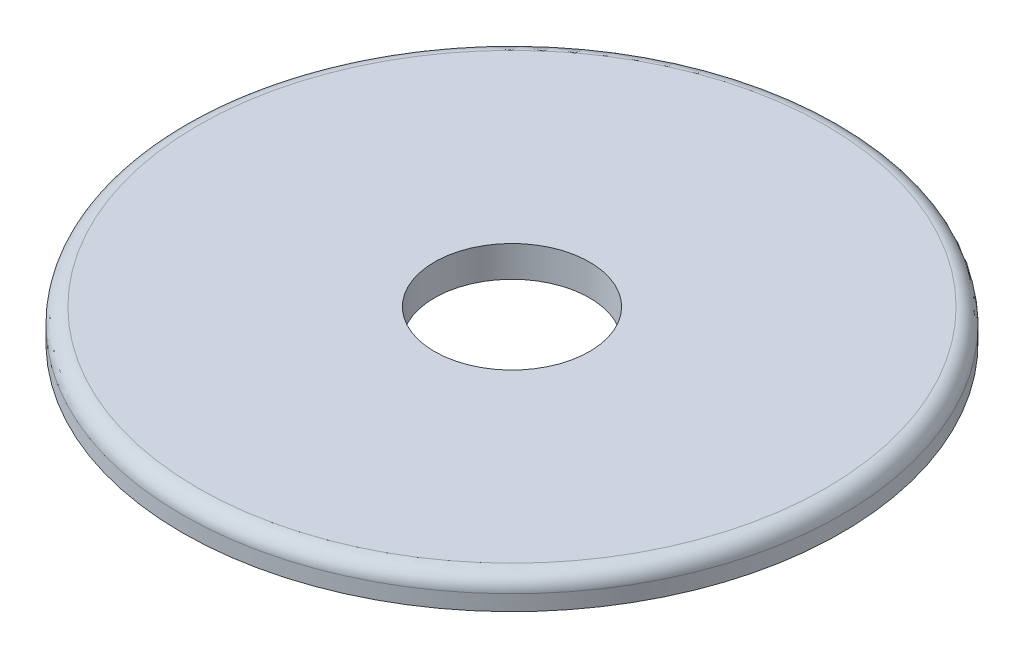
ISO-10303-21;
HEADER;
FILE_DESCRIPTION(('STEP AP214'),'2;1');
FILE_NAME('part.step','',(''),(''),'','','');
FILE_SCHEMA(('AUTOMOTIVE_DESIGN { 1 0 10303 214 1 1 1 1 }'));
ENDSEC;
DATA;
#1=APPLICATION_CONTEXT('core data for automotive mechanical design processes');
#2=APPLICATION_PROTOCOL_DEFINITION('international standard','automotive_design',2000,#1);
#3=PRODUCT_CONTEXT('',#1,'mechanical');
#4=PRODUCT('Part','Part','',(#3));
#5=PRODUCT_RELATED_PRODUCT_CATEGORY('part','',(#4));
#6=PRODUCT_DEFINITION_FORMATION('','',#4);
#7=PRODUCT_DEFINITION_CONTEXT('part definition',#1,'design');
#8=PRODUCT_DEFINITION('design','',#6,#7);
#9=PRODUCT_DEFINITION_SHAPE('','',#8);
#10=(LENGTH_UNIT() NAMED_UNIT(*) SI_UNIT(.MILLI.,.METRE.));
#11=(NAMED_UNIT(*) PLANE_ANGLE_UNIT() SI_UNIT($,.RADIAN.));
#12=(NAMED_UNIT(*) SI_UNIT($,.STERADIAN.) SOLID_ANGLE_UNIT());
#13=UNCERTAINTY_MEASURE_WITH_UNIT(LENGTH_MEASURE(1.E-05),#10,'distance_accuracy_value','');
#14=(GEOMETRIC_REPRESENTATION_CONTEXT(3) GLOBAL_UNCERTAINTY_ASSIGNED_CONTEXT((#13)) GLOBAL_UNIT_ASSIGNED_CONTEXT((#10,
#11,#12)) REPRESENTATION_CONTEXT('',''));
#15=CARTESIAN_POINT('',(0.,0.,0.));
#16=DIRECTION('',(0.,0.,1.));
#17=DIRECTION('',(1.,0.,0.));
#18=AXIS2_PLACEMENT_3D('',#15,#16,#17);
#19=CARTESIAN_POINT('',(0.,2.,0.));
#20=DIRECTION('',(0.,1.,0.));
#21=DIRECTION('',(0.,0.,1.));
#22=AXIS2_PLACEMENT_3D('',#19,#20,#21);
#23=PLANE('',#22);
#24=CARTESIAN_POINT('',(0.,2.,0.));
#25=DIRECTION('',(0.,1.,0.));
#26=DIRECTION('',(0.,0.,1.));
#27=AXIS2_PLACEMENT_3D('',#24,#25,#26);
#28=CIRCLE('',#27,20.25);
#29=CARTESIAN_POINT('',(0.,2.,20.25));
#30=VERTEX_POINT('',#29);
#31=EDGE_CURVE('E40',#30,#30,#28,.T.);
#32=ORIENTED_EDGE('',*,*,#31,.T.);
#33=EDGE_LOOP('',(#32));
#34=FACE_BOUND('',#33,.T.);
#35=CARTESIAN_POINT('',(0.,2.,0.));
#36=DIRECTION('',(0.,1.,0.));
#37=DIRECTION('',(0.,0.,1.));
#38=AXIS2_PLACEMENT_3D('',#35,#36,#37);
#39=CIRCLE('',#38,5.);
#40=CARTESIAN_POINT('',(0.,2.,5.));
#41=VERTEX_POINT('',#40);
#42=EDGE_CURVE('E48',#41,#41,#39,.T.);
#43=ORIENTED_EDGE('',*,*,#42,.F.);
#44=EDGE_LOOP('',(#43));
#45=FACE_BOUND('',#44,.T.);
#46=ADVANCED_FACE('F33',(#34,#45),#23,.T.);
#47=CARTESIAN_POINT('',(0.,0.,0.));
#48=DIRECTION('',(0.,1.,0.));
#49=DIRECTION('',(0.,0.,1.));
#50=AXIS2_PLACEMENT_3D('',#47,#48,#49);
#51=PLANE('',#50);
#52=CARTESIAN_POINT('',(0.,0.,0.));
#53=DIRECTION('',(0.,1.,0.));
#54=DIRECTION('',(0.,0.,1.));
#55=AXIS2_PLACEMENT_3D('',#52,#53,#54);
#56=CIRCLE('',#55,21.25);
#57=CARTESIAN_POINT('',(0.,0.,21.25));
#58=VERTEX_POINT('',#57);
#59=EDGE_CURVE('E44',#58,#58,#56,.T.);
#60=ORIENTED_EDGE('',*,*,#59,.F.);
#61=EDGE_LOOP('',(#60));
#62=FACE_BOUND('',#61,.T.);
#63=CARTESIAN_POINT('',(0.,0.,0.));
#64=DIRECTION('',(0.,1.,0.));
#65=DIRECTION('',(0.,0.,1.));
#66=AXIS2_PLACEMENT_3D('',#63,#64,#65);
#67=CIRCLE('',#66,5.);
#68=CARTESIAN_POINT('',(0.,0.,5.));
#69=VERTEX_POINT('',#68);
#70=EDGE_CURVE('E51',#69,#69,#67,.T.);
#71=ORIENTED_EDGE('',*,*,#70,.T.);
#72=EDGE_LOOP('',(#71));
#73=FACE_BOUND('',#72,.T.);
#74=ADVANCED_FACE('F61',(#62,#73),#51,.F.);
#75=CARTESIAN_POINT('',(0.,2.,0.));
#76=DIRECTION('',(0.,-1.,0.));
#77=DIRECTION('',(0.,0.,-1.));
#78=AXIS2_PLACEMENT_3D('',#75,#76,#77);
#79=CYLINDRICAL_SURFACE('',#78,21.25);
#80=CARTESIAN_POINT('',(0.,1.,0.));
#81=DIRECTION('',(0.,1.,0.));
#82=DIRECTION('',(0.,0.,1.));
#83=AXIS2_PLACEMENT_3D('',#80,#81,#82);
#84=CIRCLE('',#83,21.25);
#85=CARTESIAN_POINT('',(0.,1.,21.25));
#86=VERTEX_POINT('',#85);
#87=EDGE_CURVE('E10',#86,#86,#84,.F.);
#88=ORIENTED_EDGE('',*,*,#87,.T.);
#89=EDGE_LOOP('',(#88));
#90=FACE_BOUND('',#89,.T.);
#91=ORIENTED_EDGE('',*,*,#59,.T.);
#92=EDGE_LOOP('',(#91));
#93=FACE_BOUND('',#92,.T.);
#94=ADVANCED_FACE('F66',(#90,#93),#79,.T.);
#95=CARTESIAN_POINT('',(0.,2.,0.));
#96=DIRECTION('',(0.,-1.,0.));
#97=DIRECTION('',(0.,0.,-1.));
#98=AXIS2_PLACEMENT_3D('',#95,#96,#97);
#99=CYLINDRICAL_SURFACE('',#98,5.);
#100=ORIENTED_EDGE('',*,*,#42,.T.);
#101=EDGE_LOOP('',(#100));
#102=FACE_BOUND('',#101,.T.);
#103=ORIENTED_EDGE('',*,*,#70,.F.);
#104=EDGE_LOOP('',(#103));
#105=FACE_BOUND('',#104,.T.);
#106=ADVANCED_FACE('F57',(#102,#105),#99,.F.);
#107=CARTESIAN_POINT('',(0.,1.,0.));
#108=DIRECTION('',(0.,1.,0.));
#109=DIRECTION('',(0.,0.,1.));
#110=AXIS2_PLACEMENT_3D('',#107,#108,#109);
#111=TOROIDAL_SURFACE('',#110,20.25,1.);
#112=ORIENTED_EDGE('',*,*,#87,.F.);
#113=EDGE_LOOP('',(#112));
#114=FACE_BOUND('',#113,.T.);
#115=ORIENTED_EDGE('',*,*,#31,.F.);
#116=EDGE_LOOP('',(#115));
#117=FACE_BOUND('',#116,.T.);
#118=ADVANCED_FACE('F35',(#114,#117),#111,.T.);
#119=CLOSED_SHELL('',(#46,#74,#94,#106,#118));
#120=MANIFOLD_SOLID_BREP('B2',#119);
#121=ADVANCED_BREP_SHAPE_REPRESENTATION('',(#18,#120),#14);
#122=SHAPE_DEFINITION_REPRESENTATION(#9,#121);
ENDSEC;
END-ISO-10303-21;
